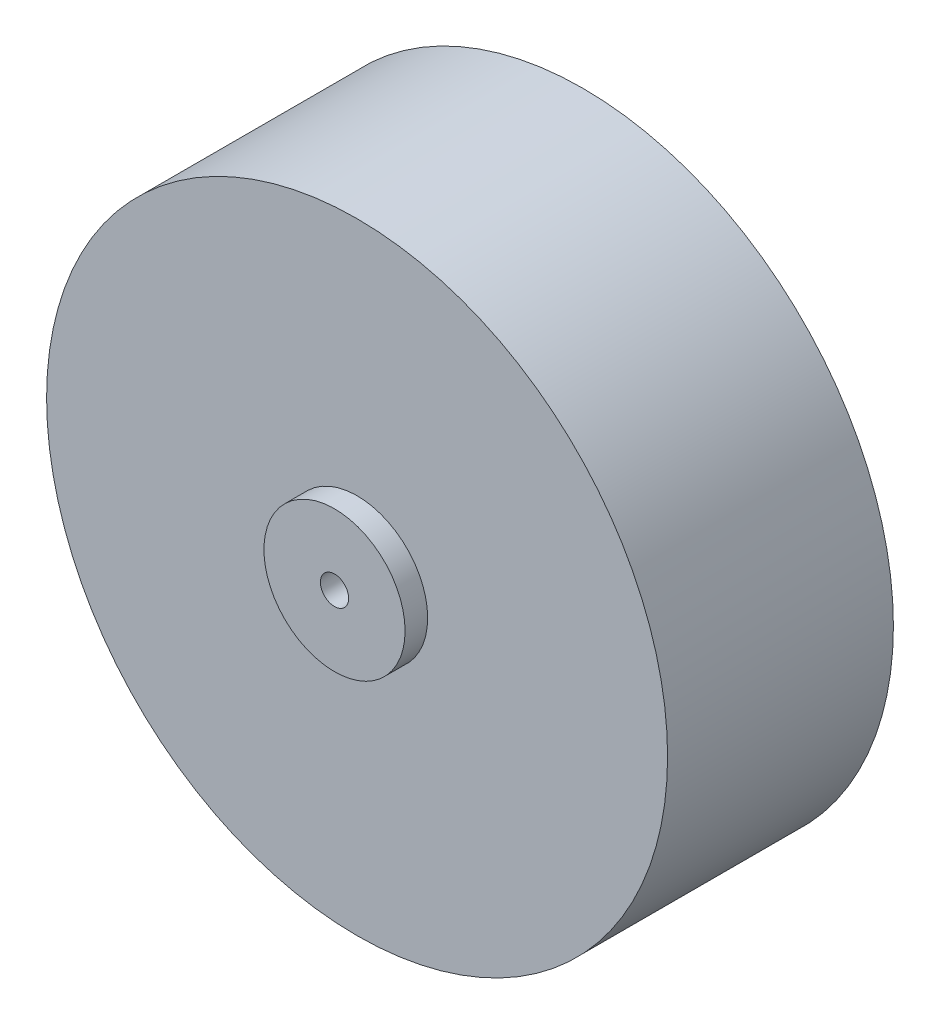
ISO-10303-21;
HEADER;
FILE_DESCRIPTION(('STEP AP214'),'2;1');
FILE_NAME('part.step','',(''),(''),'','','');
FILE_SCHEMA(('AUTOMOTIVE_DESIGN { 1 0 10303 214 1 1 1 1 }'));
ENDSEC;
DATA;
#1=APPLICATION_CONTEXT('core data for automotive mechanical design processes');
#2=APPLICATION_PROTOCOL_DEFINITION('international standard','automotive_design',2000,#1);
#3=PRODUCT_CONTEXT('',#1,'mechanical');
#4=PRODUCT('Part','Part','',(#3));
#5=PRODUCT_RELATED_PRODUCT_CATEGORY('part','',(#4));
#6=PRODUCT_DEFINITION_FORMATION('','',#4);
#7=PRODUCT_DEFINITION_CONTEXT('part definition',#1,'design');
#8=PRODUCT_DEFINITION('design','',#6,#7);
#9=PRODUCT_DEFINITION_SHAPE('','',#8);
#10=(LENGTH_UNIT() NAMED_UNIT(*) SI_UNIT(.MILLI.,.METRE.));
#11=(NAMED_UNIT(*) PLANE_ANGLE_UNIT() SI_UNIT($,.RADIAN.));
#12=(NAMED_UNIT(*) SI_UNIT($,.STERADIAN.) SOLID_ANGLE_UNIT());
#13=UNCERTAINTY_MEASURE_WITH_UNIT(LENGTH_MEASURE(1.E-05),#10,'distance_accuracy_value','');
#14=(GEOMETRIC_REPRESENTATION_CONTEXT(3) GLOBAL_UNCERTAINTY_ASSIGNED_CONTEXT((#13)) GLOBAL_UNIT_ASSIGNED_CONTEXT((#10,
#11,#12)) REPRESENTATION_CONTEXT('',''));
#15=CARTESIAN_POINT('',(0.,0.,0.));
#16=DIRECTION('',(0.,0.,1.));
#17=DIRECTION('',(1.,0.,0.));
#18=AXIS2_PLACEMENT_3D('',#15,#16,#17);
#19=CARTESIAN_POINT('',(0.,0.,20.));
#20=DIRECTION('',(0.,0.,-1.));
#21=DIRECTION('',(-1.,0.,0.));
#22=AXIS2_PLACEMENT_3D('',#19,#20,#21);
#23=CYLINDRICAL_SURFACE('',#22,55.);
#24=CARTESIAN_POINT('',(0.,0.,20.));
#25=DIRECTION('',(0.,0.,1.));
#26=DIRECTION('',(1.,0.,0.));
#27=AXIS2_PLACEMENT_3D('',#24,#25,#26);
#28=CIRCLE('',#27,55.);
#29=CARTESIAN_POINT('',(55.,0.,20.));
#30=VERTEX_POINT('',#29);
#31=EDGE_CURVE('E47',#30,#30,#28,.T.);
#32=ORIENTED_EDGE('',*,*,#31,.F.);
#33=EDGE_LOOP('',(#32));
#34=FACE_BOUND('',#33,.T.);
#35=CARTESIAN_POINT('',(0.,0.,-20.));
#36=DIRECTION('',(0.,0.,1.));
#37=DIRECTION('',(1.,0.,0.));
#38=AXIS2_PLACEMENT_3D('',#35,#36,#37);
#39=CIRCLE('',#38,55.);
#40=CARTESIAN_POINT('',(55.,0.,-20.));
#41=VERTEX_POINT('',#40);
#42=EDGE_CURVE('E42',#41,#41,#39,.T.);
#43=ORIENTED_EDGE('',*,*,#42,.T.);
#44=EDGE_LOOP('',(#43));
#45=FACE_BOUND('',#44,.T.);
#46=ADVANCED_FACE('F39',(#34,#45),#23,.T.);
#47=CARTESIAN_POINT('',(0.,0.,20.));
#48=DIRECTION('',(0.,0.,1.));
#49=DIRECTION('',(1.,0.,0.));
#50=AXIS2_PLACEMENT_3D('',#47,#48,#49);
#51=PLANE('',#50);
#52=CARTESIAN_POINT('',(0.,0.,20.));
#53=DIRECTION('',(0.,0.,1.));
#54=DIRECTION('',(1.,0.,0.));
#55=AXIS2_PLACEMENT_3D('',#52,#53,#54);
#56=CIRCLE('',#55,12.5);
#57=CARTESIAN_POINT('',(12.5,0.,20.));
#58=VERTEX_POINT('',#57);
#59=EDGE_CURVE('E10',#58,#58,#56,.T.);
#60=ORIENTED_EDGE('',*,*,#59,.F.);
#61=EDGE_LOOP('',(#60));
#62=FACE_BOUND('',#61,.T.);
#63=ORIENTED_EDGE('',*,*,#31,.T.);
#64=EDGE_LOOP('',(#63));
#65=FACE_BOUND('',#64,.T.);
#66=ADVANCED_FACE('F94',(#62,#65),#51,.T.);
#67=CARTESIAN_POINT('',(0.,0.,-20.));
#68=DIRECTION('',(0.,0.,1.));
#69=DIRECTION('',(1.,0.,0.));
#70=AXIS2_PLACEMENT_3D('',#67,#68,#69);
#71=PLANE('',#70);
#72=CARTESIAN_POINT('',(0.,0.,-20.));
#73=DIRECTION('',(0.,0.,1.));
#74=DIRECTION('',(1.,0.,0.));
#75=AXIS2_PLACEMENT_3D('',#72,#73,#74);
#76=CIRCLE('',#75,12.5);
#77=CARTESIAN_POINT('',(12.5,0.,-20.));
#78=VERTEX_POINT('',#77);
#79=EDGE_CURVE('E59',#78,#78,#76,.T.);
#80=ORIENTED_EDGE('',*,*,#79,.T.);
#81=EDGE_LOOP('',(#80));
#82=FACE_BOUND('',#81,.T.);
#83=ORIENTED_EDGE('',*,*,#42,.F.);
#84=EDGE_LOOP('',(#83));
#85=FACE_BOUND('',#84,.T.);
#86=ADVANCED_FACE('F90',(#82,#85),#71,.F.);
#87=CARTESIAN_POINT('',(0.,0.,24.));
#88=DIRECTION('',(0.,0.,-1.));
#89=DIRECTION('',(-1.,0.,0.));
#90=AXIS2_PLACEMENT_3D('',#87,#88,#89);
#91=CYLINDRICAL_SURFACE('',#90,12.5);
#92=CARTESIAN_POINT('',(0.,0.,24.));
#93=DIRECTION('',(0.,0.,1.));
#94=DIRECTION('',(1.,0.,0.));
#95=AXIS2_PLACEMENT_3D('',#92,#93,#94);
#96=CIRCLE('',#95,12.5);
#97=CARTESIAN_POINT('',(12.5,0.,24.));
#98=VERTEX_POINT('',#97);
#99=EDGE_CURVE('E54',#98,#98,#96,.T.);
#100=ORIENTED_EDGE('',*,*,#99,.F.);
#101=EDGE_LOOP('',(#100));
#102=FACE_BOUND('',#101,.T.);
#103=ORIENTED_EDGE('',*,*,#59,.T.);
#104=EDGE_LOOP('',(#103));
#105=FACE_BOUND('',#104,.T.);
#106=ADVANCED_FACE('F93',(#102,#105),#91,.T.);
#107=CARTESIAN_POINT('',(0.,0.,24.));
#108=DIRECTION('',(0.,0.,1.));
#109=DIRECTION('',(1.,0.,0.));
#110=AXIS2_PLACEMENT_3D('',#107,#108,#109);
#111=PLANE('',#110);
#112=CARTESIAN_POINT('',(0.,0.,24.));
#113=DIRECTION('',(0.,0.,1.));
#114=DIRECTION('',(1.,0.,0.));
#115=AXIS2_PLACEMENT_3D('',#112,#113,#114);
#116=CIRCLE('',#115,2.5);
#117=CARTESIAN_POINT('',(2.5,0.,24.));
#118=VERTEX_POINT('',#117);
#119=EDGE_CURVE('E67',#118,#118,#116,.T.);
#120=ORIENTED_EDGE('',*,*,#119,.F.);
#121=EDGE_LOOP('',(#120));
#122=FACE_BOUND('',#121,.T.);
#123=ORIENTED_EDGE('',*,*,#99,.T.);
#124=EDGE_LOOP('',(#123));
#125=FACE_BOUND('',#124,.T.);
#126=ADVANCED_FACE('F86',(#122,#125),#111,.T.);
#127=CARTESIAN_POINT('',(0.,0.,-24.));
#128=DIRECTION('',(0.,0.,1.));
#129=DIRECTION('',(1.,0.,0.));
#130=AXIS2_PLACEMENT_3D('',#127,#128,#129);
#131=CYLINDRICAL_SURFACE('',#130,12.5);
#132=CARTESIAN_POINT('',(0.,0.,-24.));
#133=DIRECTION('',(0.,0.,1.));
#134=DIRECTION('',(1.,0.,0.));
#135=AXIS2_PLACEMENT_3D('',#132,#133,#134);
#136=CIRCLE('',#135,12.5);
#137=CARTESIAN_POINT('',(12.5,0.,-24.));
#138=VERTEX_POINT('',#137);
#139=EDGE_CURVE('E58',#138,#138,#136,.T.);
#140=ORIENTED_EDGE('',*,*,#139,.T.);
#141=EDGE_LOOP('',(#140));
#142=FACE_BOUND('',#141,.T.);
#143=ORIENTED_EDGE('',*,*,#79,.F.);
#144=EDGE_LOOP('',(#143));
#145=FACE_BOUND('',#144,.T.);
#146=ADVANCED_FACE('F80',(#142,#145),#131,.T.);
#147=CARTESIAN_POINT('',(0.,0.,-24.));
#148=DIRECTION('',(0.,0.,-1.));
#149=DIRECTION('',(1.,0.,0.));
#150=AXIS2_PLACEMENT_3D('',#147,#148,#149);
#151=PLANE('',#150);
#152=CARTESIAN_POINT('',(0.,0.,-24.));
#153=DIRECTION('',(0.,0.,-1.));
#154=DIRECTION('',(-1.,0.,0.));
#155=AXIS2_PLACEMENT_3D('',#152,#153,#154);
#156=CIRCLE('',#155,2.5);
#157=CARTESIAN_POINT('',(-2.5,0.,-24.));
#158=VERTEX_POINT('',#157);
#159=EDGE_CURVE('E63',#158,#158,#156,.T.);
#160=ORIENTED_EDGE('',*,*,#159,.F.);
#161=EDGE_LOOP('',(#160));
#162=FACE_BOUND('',#161,.T.);
#163=ORIENTED_EDGE('',*,*,#139,.F.);
#164=EDGE_LOOP('',(#163));
#165=FACE_BOUND('',#164,.T.);
#166=ADVANCED_FACE('F77',(#162,#165),#151,.T.);
#167=CARTESIAN_POINT('',(0.,0.,-24.));
#168=DIRECTION('',(0.,0.,1.));
#169=DIRECTION('',(1.,0.,0.));
#170=AXIS2_PLACEMENT_3D('',#167,#168,#169);
#171=CYLINDRICAL_SURFACE('',#170,2.5);
#172=ORIENTED_EDGE('',*,*,#119,.T.);
#173=EDGE_LOOP('',(#172));
#174=FACE_BOUND('',#173,.T.);
#175=ORIENTED_EDGE('',*,*,#159,.T.);
#176=EDGE_LOOP('',(#175));
#177=FACE_BOUND('',#176,.T.);
#178=ADVANCED_FACE('F75',(#174,#177),#171,.F.);
#179=CLOSED_SHELL('',(#46,#66,#86,#106,#126,#146,#166,#178));
#180=MANIFOLD_SOLID_BREP('B2',#179);
#181=ADVANCED_BREP_SHAPE_REPRESENTATION('',(#18,#180),#14);
#182=SHAPE_DEFINITION_REPRESENTATION(#9,#181);
ENDSEC;
END-ISO-10303-21;
